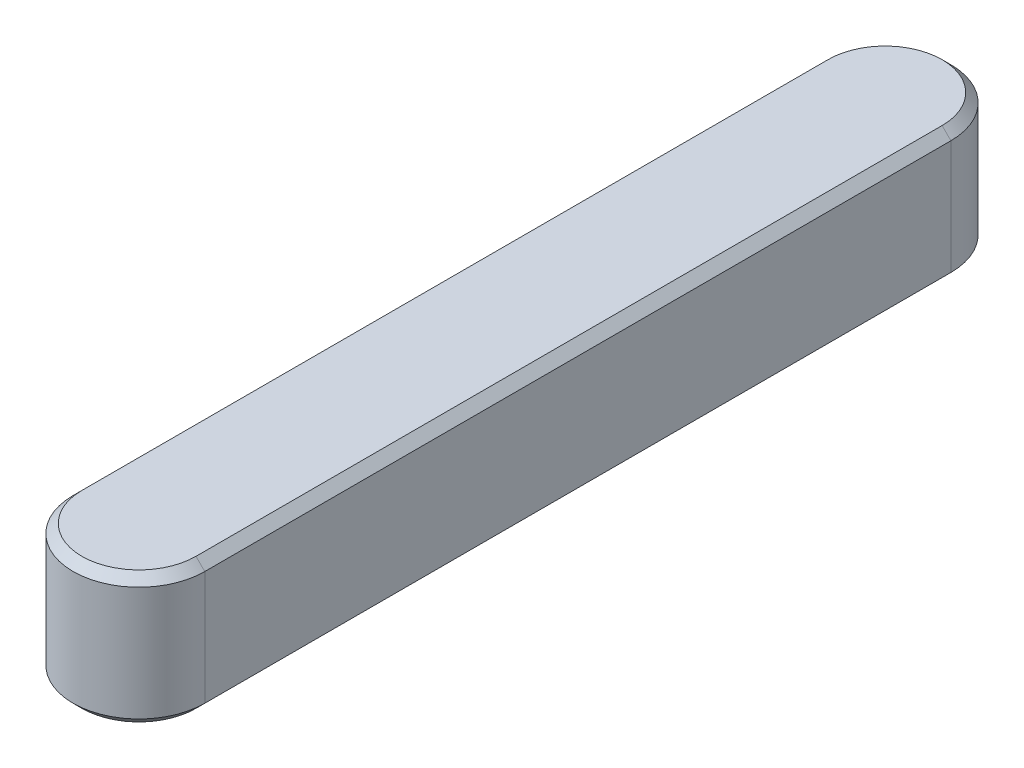
ISO-10303-21;
HEADER;
FILE_DESCRIPTION(('STEP AP214'),'2;1');
FILE_NAME('part.step','',(''),(''),'','','');
FILE_SCHEMA(('AUTOMOTIVE_DESIGN { 1 0 10303 214 1 1 1 1 }'));
ENDSEC;
DATA;
#1=APPLICATION_CONTEXT('core data for automotive mechanical design processes');
#2=APPLICATION_PROTOCOL_DEFINITION('international standard','automotive_design',2000,#1);
#3=PRODUCT_CONTEXT('',#1,'mechanical');
#4=PRODUCT('Part','Part','',(#3));
#5=PRODUCT_RELATED_PRODUCT_CATEGORY('part','',(#4));
#6=PRODUCT_DEFINITION_FORMATION('','',#4);
#7=PRODUCT_DEFINITION_CONTEXT('part definition',#1,'design');
#8=PRODUCT_DEFINITION('design','',#6,#7);
#9=PRODUCT_DEFINITION_SHAPE('','',#8);
#10=(LENGTH_UNIT() NAMED_UNIT(*) SI_UNIT(.MILLI.,.METRE.));
#11=(NAMED_UNIT(*) PLANE_ANGLE_UNIT() SI_UNIT($,.RADIAN.));
#12=(NAMED_UNIT(*) SI_UNIT($,.STERADIAN.) SOLID_ANGLE_UNIT());
#13=UNCERTAINTY_MEASURE_WITH_UNIT(LENGTH_MEASURE(1.E-05),#10,'distance_accuracy_value','');
#14=(GEOMETRIC_REPRESENTATION_CONTEXT(3) GLOBAL_UNCERTAINTY_ASSIGNED_CONTEXT((#13)) GLOBAL_UNIT_ASSIGNED_CONTEXT((#10,
#11,#12)) REPRESENTATION_CONTEXT('',''));
#15=CARTESIAN_POINT('',(0.,0.,0.));
#16=DIRECTION('',(0.,0.,1.));
#17=DIRECTION('',(1.,0.,0.));
#18=AXIS2_PLACEMENT_3D('',#15,#16,#17);
#19=CARTESIAN_POINT('',(-24.8890804597701,14.0502873563218,20.));
#20=DIRECTION('',(0.,-1.,0.));
#21=DIRECTION('',(0.,0.,-1.));
#22=AXIS2_PLACEMENT_3D('',#19,#20,#21);
#23=PLANE('',#22);
#24=DIRECTION('',(0.,0.,-1.));
#25=VECTOR('',#24,1.);
#26=CARTESIAN_POINT('',(-22.0890804597701,14.0502873563218,20.));
#27=LINE('',#26,#25);
#28=CARTESIAN_POINT('',(-22.0890804597701,14.0502873563218,18.5));
#29=VERTEX_POINT('',#28);
#30=CARTESIAN_POINT('',(-22.0890804597701,14.0502873563218,1.5));
#31=VERTEX_POINT('',#30);
#32=EDGE_CURVE('E55',#29,#31,#27,.T.);
#33=ORIENTED_EDGE('',*,*,#32,.T.);
#34=CARTESIAN_POINT('',(-23.3890804597701,14.0502873563218,1.5));
#35=DIRECTION('',(0.,-1.,0.));
#36=DIRECTION('',(0.,0.,-1.));
#37=AXIS2_PLACEMENT_3D('',#34,#35,#36);
#38=CIRCLE('',#37,1.3);
#39=CARTESIAN_POINT('',(-24.6890804597701,14.0502873563218,1.5));
#40=VERTEX_POINT('',#39);
#41=EDGE_CURVE('E12',#31,#40,#38,.F.);
#42=ORIENTED_EDGE('',*,*,#41,.T.);
#43=DIRECTION('',(0.,0.,1.));
#44=VECTOR('',#43,1.);
#45=CARTESIAN_POINT('',(-24.6890804597701,14.0502873563218,20.));
#46=LINE('',#45,#44);
#47=CARTESIAN_POINT('',(-24.6890804597701,14.0502873563218,18.5));
#48=VERTEX_POINT('',#47);
#49=EDGE_CURVE('E40',#40,#48,#46,.T.);
#50=ORIENTED_EDGE('',*,*,#49,.T.);
#51=CARTESIAN_POINT('',(-23.3890804597701,14.0502873563218,18.5));
#52=DIRECTION('',(0.,-1.,0.));
#53=DIRECTION('',(0.,0.,-1.));
#54=AXIS2_PLACEMENT_3D('',#51,#52,#53);
#55=CIRCLE('',#54,1.3);
#56=EDGE_CURVE('E162',#48,#29,#55,.F.);
#57=ORIENTED_EDGE('',*,*,#56,.T.);
#58=EDGE_LOOP('',(#33,#42,#50,#57));
#59=FACE_BOUND('',#58,.T.);
#60=ADVANCED_FACE('F31',(#59),#23,.F.);
#61=CARTESIAN_POINT('',(-24.8890804597701,14.0502873563218,20.));
#62=DIRECTION('',(1.,0.,0.));
#63=DIRECTION('',(0.,0.,-1.));
#64=AXIS2_PLACEMENT_3D('',#61,#62,#63);
#65=PLANE('',#64);
#66=DIRECTION('',(0.,1.,0.));
#67=VECTOR('',#66,1.);
#68=CARTESIAN_POINT('',(-24.8890804597701,-5.94971264367817,1.5));
#69=LINE('',#68,#67);
#70=CARTESIAN_POINT('',(-24.8890804597701,11.2502873563218,1.5));
#71=VERTEX_POINT('',#70);
#72=CARTESIAN_POINT('',(-24.8890804597701,13.8502873563218,1.5));
#73=VERTEX_POINT('',#72);
#74=EDGE_CURVE('E129',#71,#73,#69,.T.);
#75=ORIENTED_EDGE('',*,*,#74,.F.);
#76=DIRECTION('',(0.,0.,1.));
#77=VECTOR('',#76,1.);
#78=CARTESIAN_POINT('',(-24.8890804597701,11.2502873563218,20.));
#79=LINE('',#78,#77);
#80=CARTESIAN_POINT('',(-24.8890804597701,11.2502873563218,18.5));
#81=VERTEX_POINT('',#80);
#82=EDGE_CURVE('E113',#71,#81,#79,.T.);
#83=ORIENTED_EDGE('',*,*,#82,.T.);
#84=DIRECTION('',(0.,1.,0.));
#85=VECTOR('',#84,1.);
#86=CARTESIAN_POINT('',(-24.8890804597701,-5.94971264367817,18.5));
#87=LINE('',#86,#85);
#88=CARTESIAN_POINT('',(-24.8890804597701,13.8502873563218,18.5));
#89=VERTEX_POINT('',#88);
#90=EDGE_CURVE('E138',#81,#89,#87,.T.);
#91=ORIENTED_EDGE('',*,*,#90,.T.);
#92=DIRECTION('',(0.,0.,-1.));
#93=VECTOR('',#92,1.);
#94=CARTESIAN_POINT('',(-24.8890804597701,13.8502873563218,20.));
#95=LINE('',#94,#93);
#96=EDGE_CURVE('E122',#89,#73,#95,.T.);
#97=ORIENTED_EDGE('',*,*,#96,.T.);
#98=EDGE_LOOP('',(#75,#83,#91,#97));
#99=FACE_BOUND('',#98,.T.);
#100=ADVANCED_FACE('F136',(#99),#65,.F.);
#101=CARTESIAN_POINT('',(-21.8890804597701,11.0502873563218,20.));
#102=DIRECTION('',(0.,1.,0.));
#103=DIRECTION('',(0.,0.,1.));
#104=AXIS2_PLACEMENT_3D('',#101,#102,#103);
#105=PLANE('',#104);
#106=DIRECTION('',(0.,0.,-1.));
#107=VECTOR('',#106,1.);
#108=CARTESIAN_POINT('',(-24.6890804597701,11.0502873563218,20.));
#109=LINE('',#108,#107);
#110=CARTESIAN_POINT('',(-24.6890804597701,11.0502873563218,18.5));
#111=VERTEX_POINT('',#110);
#112=CARTESIAN_POINT('',(-24.6890804597701,11.0502873563218,1.5));
#113=VERTEX_POINT('',#112);
#114=EDGE_CURVE('E151',#111,#113,#109,.T.);
#115=ORIENTED_EDGE('',*,*,#114,.T.);
#116=CARTESIAN_POINT('',(-23.3890804597701,11.0502873563218,1.5));
#117=DIRECTION('',(0.,1.,0.));
#118=DIRECTION('',(0.,0.,1.));
#119=AXIS2_PLACEMENT_3D('',#116,#117,#118);
#120=CIRCLE('',#119,1.3);
#121=CARTESIAN_POINT('',(-22.0890804597701,11.0502873563218,1.5));
#122=VERTEX_POINT('',#121);
#123=EDGE_CURVE('E107',#113,#122,#120,.F.);
#124=ORIENTED_EDGE('',*,*,#123,.T.);
#125=DIRECTION('',(0.,0.,1.));
#126=VECTOR('',#125,1.);
#127=CARTESIAN_POINT('',(-22.0890804597701,11.0502873563218,20.));
#128=LINE('',#127,#126);
#129=CARTESIAN_POINT('',(-22.0890804597701,11.0502873563218,18.5));
#130=VERTEX_POINT('',#129);
#131=EDGE_CURVE('E149',#122,#130,#128,.T.);
#132=ORIENTED_EDGE('',*,*,#131,.T.);
#133=CARTESIAN_POINT('',(-23.3890804597701,11.0502873563218,18.5));
#134=DIRECTION('',(0.,1.,0.));
#135=DIRECTION('',(0.,0.,1.));
#136=AXIS2_PLACEMENT_3D('',#133,#134,#135);
#137=CIRCLE('',#136,1.3);
#138=EDGE_CURVE('E133',#130,#111,#137,.F.);
#139=ORIENTED_EDGE('',*,*,#138,.T.);
#140=EDGE_LOOP('',(#115,#124,#132,#139));
#141=FACE_BOUND('',#140,.T.);
#142=ADVANCED_FACE('F197',(#141),#105,.F.);
#143=CARTESIAN_POINT('',(-21.8890804597701,14.0502873563218,20.));
#144=DIRECTION('',(-1.,0.,0.));
#145=DIRECTION('',(0.,-1.,0.));
#146=AXIS2_PLACEMENT_3D('',#143,#144,#145);
#147=PLANE('',#146);
#148=DIRECTION('',(0.,1.,0.));
#149=VECTOR('',#148,1.);
#150=CARTESIAN_POINT('',(-21.8890804597701,-5.94971264367817,18.5));
#151=LINE('',#150,#149);
#152=CARTESIAN_POINT('',(-21.8890804597701,11.2502873563218,18.5));
#153=VERTEX_POINT('',#152);
#154=CARTESIAN_POINT('',(-21.8890804597701,13.8502873563218,18.5));
#155=VERTEX_POINT('',#154);
#156=EDGE_CURVE('E141',#153,#155,#151,.T.);
#157=ORIENTED_EDGE('',*,*,#156,.F.);
#158=DIRECTION('',(0.,0.,-1.));
#159=VECTOR('',#158,1.);
#160=CARTESIAN_POINT('',(-21.8890804597701,11.2502873563218,20.));
#161=LINE('',#160,#159);
#162=CARTESIAN_POINT('',(-21.8890804597701,11.2502873563218,1.5));
#163=VERTEX_POINT('',#162);
#164=EDGE_CURVE('E156',#153,#163,#161,.T.);
#165=ORIENTED_EDGE('',*,*,#164,.T.);
#166=DIRECTION('',(0.,1.,0.));
#167=VECTOR('',#166,1.);
#168=CARTESIAN_POINT('',(-21.8890804597701,-5.94971264367817,1.5));
#169=LINE('',#168,#167);
#170=CARTESIAN_POINT('',(-21.8890804597701,13.8502873563218,1.5));
#171=VERTEX_POINT('',#170);
#172=EDGE_CURVE('E131',#163,#171,#169,.T.);
#173=ORIENTED_EDGE('',*,*,#172,.T.);
#174=DIRECTION('',(0.,0.,1.));
#175=VECTOR('',#174,1.);
#176=CARTESIAN_POINT('',(-21.8890804597701,13.8502873563218,20.));
#177=LINE('',#176,#175);
#178=EDGE_CURVE('E121',#171,#155,#177,.T.);
#179=ORIENTED_EDGE('',*,*,#178,.T.);
#180=EDGE_LOOP('',(#157,#165,#173,#179));
#181=FACE_BOUND('',#180,.T.);
#182=ADVANCED_FACE('F190',(#181),#147,.F.);
#183=CARTESIAN_POINT('',(-23.3890804597701,-5.94971264367817,18.5));
#184=DIRECTION('',(0.,1.,0.));
#185=DIRECTION('',(0.,0.,1.));
#186=AXIS2_PLACEMENT_3D('',#183,#184,#185);
#187=CYLINDRICAL_SURFACE('',#186,1.5);
#188=ORIENTED_EDGE('',*,*,#90,.F.);
#189=CARTESIAN_POINT('',(-23.3890804597701,11.2502873563218,18.5));
#190=DIRECTION('',(0.,1.,0.));
#191=DIRECTION('',(0.,0.,1.));
#192=AXIS2_PLACEMENT_3D('',#189,#190,#191);
#193=CIRCLE('',#192,1.5);
#194=EDGE_CURVE('E160',#81,#153,#193,.T.);
#195=ORIENTED_EDGE('',*,*,#194,.T.);
#196=ORIENTED_EDGE('',*,*,#156,.T.);
#197=CARTESIAN_POINT('',(-23.3890804597701,13.8502873563218,18.5));
#198=DIRECTION('',(0.,-1.,0.));
#199=DIRECTION('',(0.,0.,-1.));
#200=AXIS2_PLACEMENT_3D('',#197,#198,#199);
#201=CIRCLE('',#200,1.5);
#202=EDGE_CURVE('E158',#155,#89,#201,.T.);
#203=ORIENTED_EDGE('',*,*,#202,.T.);
#204=EDGE_LOOP('',(#188,#195,#196,#203));
#205=FACE_BOUND('',#204,.T.);
#206=ADVANCED_FACE('F184',(#205),#187,.T.);
#207=CARTESIAN_POINT('',(-23.3890804597701,-5.94971264367817,1.5));
#208=DIRECTION('',(0.,1.,0.));
#209=DIRECTION('',(0.,0.,1.));
#210=AXIS2_PLACEMENT_3D('',#207,#208,#209);
#211=CYLINDRICAL_SURFACE('',#210,1.5);
#212=ORIENTED_EDGE('',*,*,#172,.F.);
#213=CARTESIAN_POINT('',(-23.3890804597701,11.2502873563218,1.5));
#214=DIRECTION('',(0.,1.,0.));
#215=DIRECTION('',(0.,0.,1.));
#216=AXIS2_PLACEMENT_3D('',#213,#214,#215);
#217=CIRCLE('',#216,1.5);
#218=EDGE_CURVE('E105',#163,#71,#217,.T.);
#219=ORIENTED_EDGE('',*,*,#218,.T.);
#220=ORIENTED_EDGE('',*,*,#74,.T.);
#221=CARTESIAN_POINT('',(-23.3890804597701,13.8502873563218,1.5));
#222=DIRECTION('',(0.,-1.,0.));
#223=DIRECTION('',(0.,0.,-1.));
#224=AXIS2_PLACEMENT_3D('',#221,#222,#223);
#225=CIRCLE('',#224,1.5);
#226=EDGE_CURVE('E134',#73,#171,#225,.T.);
#227=ORIENTED_EDGE('',*,*,#226,.T.);
#228=EDGE_LOOP('',(#212,#219,#220,#227));
#229=FACE_BOUND('',#228,.T.);
#230=ADVANCED_FACE('F127',(#229),#211,.T.);
#231=CARTESIAN_POINT('',(-23.3890804597701,11.2502873563218,18.5));
#232=DIRECTION('',(0.,1.,0.));
#233=DIRECTION('',(0.,0.,1.));
#234=AXIS2_PLACEMENT_3D('',#231,#232,#233);
#235=CONICAL_SURFACE('',#234,1.5,0.785398163397444);
#236=DIRECTION('',(-0.707106781186548,0.707106781186548,0.));
#237=VECTOR('',#236,1.);
#238=CARTESIAN_POINT('',(-24.6890804597701,11.0502873563218,18.5));
#239=LINE('',#238,#237);
#240=EDGE_CURVE('E116',#111,#81,#239,.T.);
#241=ORIENTED_EDGE('',*,*,#240,.F.);
#242=ORIENTED_EDGE('',*,*,#138,.F.);
#243=DIRECTION('',(-0.707106781186548,-0.707106781186548,0.));
#244=VECTOR('',#243,1.);
#245=CARTESIAN_POINT('',(-21.8890804597701,11.2502873563218,18.5));
#246=LINE('',#245,#244);
#247=EDGE_CURVE('E139',#153,#130,#246,.T.);
#248=ORIENTED_EDGE('',*,*,#247,.F.);
#249=ORIENTED_EDGE('',*,*,#194,.F.);
#250=EDGE_LOOP('',(#241,#242,#248,#249));
#251=FACE_BOUND('',#250,.T.);
#252=ADVANCED_FACE('F199',(#251),#235,.T.);
#253=CARTESIAN_POINT('',(-21.8890804597701,11.2502873563218,20.));
#254=DIRECTION('',(-0.707106781186544,0.707106781186551,0.));
#255=DIRECTION('',(-0.707106781186551,-0.707106781186544,0.));
#256=AXIS2_PLACEMENT_3D('',#253,#254,#255);
#257=PLANE('',#256);
#258=ORIENTED_EDGE('',*,*,#247,.T.);
#259=ORIENTED_EDGE('',*,*,#131,.F.);
#260=DIRECTION('',(-0.707106781186551,-0.707106781186544,0.));
#261=VECTOR('',#260,1.);
#262=CARTESIAN_POINT('',(-21.8890804597701,11.2502873563218,1.5));
#263=LINE('',#262,#261);
#264=EDGE_CURVE('E110',#163,#122,#263,.T.);
#265=ORIENTED_EDGE('',*,*,#264,.F.);
#266=ORIENTED_EDGE('',*,*,#164,.F.);
#267=EDGE_LOOP('',(#258,#259,#265,#266));
#268=FACE_BOUND('',#267,.T.);
#269=ADVANCED_FACE('F193',(#268),#257,.F.);
#270=CARTESIAN_POINT('',(-24.6890804597701,11.0502873563218,20.));
#271=DIRECTION('',(0.707106781186544,0.707106781186551,0.));
#272=DIRECTION('',(-0.707106781186551,0.707106781186544,0.));
#273=AXIS2_PLACEMENT_3D('',#270,#271,#272);
#274=PLANE('',#273);
#275=ORIENTED_EDGE('',*,*,#240,.T.);
#276=ORIENTED_EDGE('',*,*,#82,.F.);
#277=DIRECTION('',(-0.707106781186551,0.707106781186544,0.));
#278=VECTOR('',#277,1.);
#279=CARTESIAN_POINT('',(-24.6890804597701,11.0502873563218,1.5));
#280=LINE('',#279,#278);
#281=EDGE_CURVE('E101',#113,#71,#280,.T.);
#282=ORIENTED_EDGE('',*,*,#281,.F.);
#283=ORIENTED_EDGE('',*,*,#114,.F.);
#284=EDGE_LOOP('',(#275,#276,#282,#283));
#285=FACE_BOUND('',#284,.T.);
#286=ADVANCED_FACE('F114',(#285),#274,.F.);
#287=CARTESIAN_POINT('',(-23.3890804597701,11.2502873563218,1.5));
#288=DIRECTION('',(0.,1.,0.));
#289=DIRECTION('',(0.,0.,1.));
#290=AXIS2_PLACEMENT_3D('',#287,#288,#289);
#291=CONICAL_SURFACE('',#290,1.5,0.785398163397444);
#292=ORIENTED_EDGE('',*,*,#264,.T.);
#293=ORIENTED_EDGE('',*,*,#123,.F.);
#294=ORIENTED_EDGE('',*,*,#281,.T.);
#295=ORIENTED_EDGE('',*,*,#218,.F.);
#296=EDGE_LOOP('',(#292,#293,#294,#295));
#297=FACE_BOUND('',#296,.T.);
#298=ADVANCED_FACE('F103',(#297),#291,.T.);
#299=CARTESIAN_POINT('',(-23.3890804597701,14.0502873563218,18.5));
#300=DIRECTION('',(0.,-1.,0.));
#301=DIRECTION('',(0.,0.,-1.));
#302=AXIS2_PLACEMENT_3D('',#299,#300,#301);
#303=CONICAL_SURFACE('',#302,1.3,0.785398163397435);
#304=DIRECTION('',(0.707106781186541,0.707106781186554,0.));
#305=VECTOR('',#304,1.);
#306=CARTESIAN_POINT('',(-24.8890804597701,13.8502873563218,18.5));
#307=LINE('',#306,#305);
#308=EDGE_CURVE('E170',#89,#48,#307,.T.);
#309=ORIENTED_EDGE('',*,*,#308,.F.);
#310=ORIENTED_EDGE('',*,*,#202,.F.);
#311=DIRECTION('',(0.707106781186535,-0.70710678118656,0.));
#312=VECTOR('',#311,1.);
#313=CARTESIAN_POINT('',(-22.0890804597701,14.0502873563218,18.5));
#314=LINE('',#313,#312);
#315=EDGE_CURVE('E35',#29,#155,#314,.T.);
#316=ORIENTED_EDGE('',*,*,#315,.F.);
#317=ORIENTED_EDGE('',*,*,#56,.F.);
#318=EDGE_LOOP('',(#309,#310,#316,#317));
#319=FACE_BOUND('',#318,.T.);
#320=ADVANCED_FACE('F33',(#319),#303,.T.);
#321=CARTESIAN_POINT('',(-22.0890804597701,14.0502873563218,20.));
#322=DIRECTION('',(-0.707106781186554,-0.707106781186541,0.));
#323=DIRECTION('',(0.707106781186541,-0.707106781186554,0.));
#324=AXIS2_PLACEMENT_3D('',#321,#322,#323);
#325=PLANE('',#324);
#326=ORIENTED_EDGE('',*,*,#315,.T.);
#327=ORIENTED_EDGE('',*,*,#178,.F.);
#328=DIRECTION('',(0.707106781186541,-0.707106781186554,0.));
#329=VECTOR('',#328,1.);
#330=CARTESIAN_POINT('',(-22.0890804597701,14.0502873563218,1.5));
#331=LINE('',#330,#329);
#332=EDGE_CURVE('E169',#31,#171,#331,.T.);
#333=ORIENTED_EDGE('',*,*,#332,.F.);
#334=ORIENTED_EDGE('',*,*,#32,.F.);
#335=EDGE_LOOP('',(#326,#327,#333,#334));
#336=FACE_BOUND('',#335,.T.);
#337=ADVANCED_FACE('F178',(#336),#325,.F.);
#338=CARTESIAN_POINT('',(-24.8890804597701,13.8502873563218,20.));
#339=DIRECTION('',(0.707106781186554,-0.707106781186541,0.));
#340=DIRECTION('',(0.707106781186541,0.707106781186554,0.));
#341=AXIS2_PLACEMENT_3D('',#338,#339,#340);
#342=PLANE('',#341);
#343=ORIENTED_EDGE('',*,*,#308,.T.);
#344=ORIENTED_EDGE('',*,*,#49,.F.);
#345=DIRECTION('',(0.707106781186541,0.707106781186554,0.));
#346=VECTOR('',#345,1.);
#347=CARTESIAN_POINT('',(-24.8890804597701,13.8502873563218,1.5));
#348=LINE('',#347,#346);
#349=EDGE_CURVE('E48',#73,#40,#348,.T.);
#350=ORIENTED_EDGE('',*,*,#349,.F.);
#351=ORIENTED_EDGE('',*,*,#96,.F.);
#352=EDGE_LOOP('',(#343,#344,#350,#351));
#353=FACE_BOUND('',#352,.T.);
#354=ADVANCED_FACE('F239',(#353),#342,.F.);
#355=CARTESIAN_POINT('',(-23.3890804597701,14.0502873563218,1.5));
#356=DIRECTION('',(0.,-1.,0.));
#357=DIRECTION('',(0.,0.,-1.));
#358=AXIS2_PLACEMENT_3D('',#355,#356,#357);
#359=CONICAL_SURFACE('',#358,1.3,0.785398163397435);
#360=ORIENTED_EDGE('',*,*,#332,.T.);
#361=ORIENTED_EDGE('',*,*,#226,.F.);
#362=ORIENTED_EDGE('',*,*,#349,.T.);
#363=ORIENTED_EDGE('',*,*,#41,.F.);
#364=EDGE_LOOP('',(#360,#361,#362,#363));
#365=FACE_BOUND('',#364,.T.);
#366=ADVANCED_FACE('F245',(#365),#359,.T.);
#367=CLOSED_SHELL('',(#60,#100,#142,#182,#206,#230,#252,#269,#286,#298,#320,#337,#354,#366));
#368=MANIFOLD_SOLID_BREP('B2',#367);
#369=ADVANCED_BREP_SHAPE_REPRESENTATION('',(#18,#368),#14);
#370=SHAPE_DEFINITION_REPRESENTATION(#9,#369);
ENDSEC;
END-ISO-10303-21;
